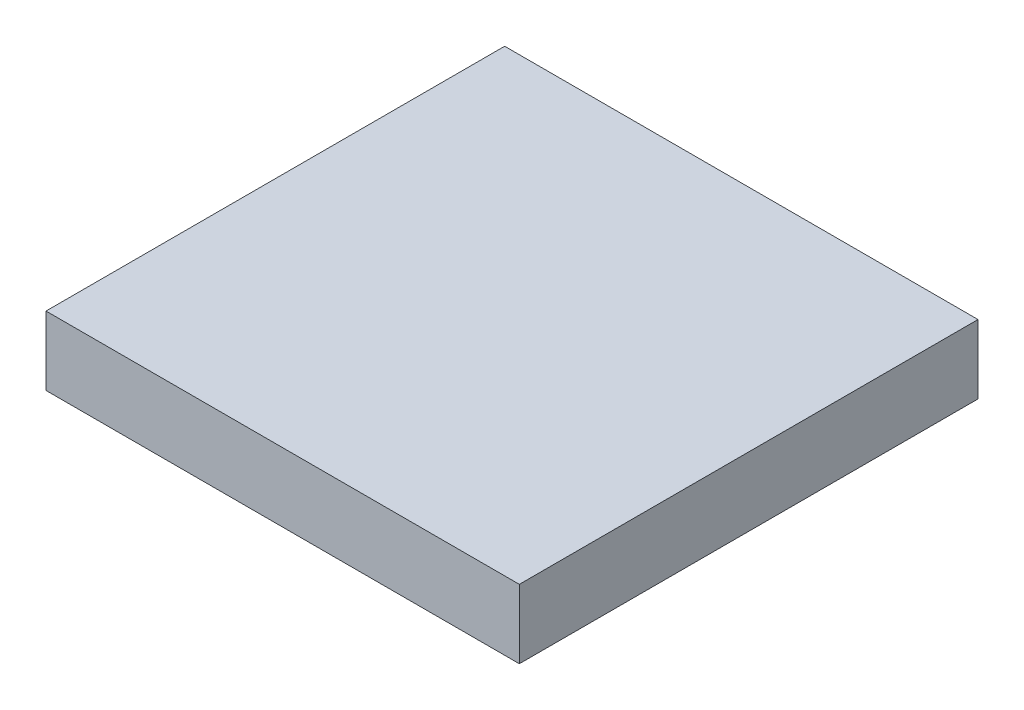
ISO-10303-21;
HEADER;
FILE_DESCRIPTION(('STEP AP214'),'2;1');
FILE_NAME('part.step','',(''),(''),'','','');
FILE_SCHEMA(('AUTOMOTIVE_DESIGN { 1 0 10303 214 1 1 1 1 }'));
ENDSEC;
DATA;
#1=APPLICATION_CONTEXT('core data for automotive mechanical design processes');
#2=APPLICATION_PROTOCOL_DEFINITION('international standard','automotive_design',2000,#1);
#3=PRODUCT_CONTEXT('',#1,'mechanical');
#4=PRODUCT('Part','Part','',(#3));
#5=PRODUCT_RELATED_PRODUCT_CATEGORY('part','',(#4));
#6=PRODUCT_DEFINITION_FORMATION('','',#4);
#7=PRODUCT_DEFINITION_CONTEXT('part definition',#1,'design');
#8=PRODUCT_DEFINITION('design','',#6,#7);
#9=PRODUCT_DEFINITION_SHAPE('','',#8);
#10=(LENGTH_UNIT() NAMED_UNIT(*) SI_UNIT(.MILLI.,.METRE.));
#11=(NAMED_UNIT(*) PLANE_ANGLE_UNIT() SI_UNIT($,.RADIAN.));
#12=(NAMED_UNIT(*) SI_UNIT($,.STERADIAN.) SOLID_ANGLE_UNIT());
#13=UNCERTAINTY_MEASURE_WITH_UNIT(LENGTH_MEASURE(1.E-05),#10,'distance_accuracy_value','');
#14=(GEOMETRIC_REPRESENTATION_CONTEXT(3) GLOBAL_UNCERTAINTY_ASSIGNED_CONTEXT((#13)) GLOBAL_UNIT_ASSIGNED_CONTEXT((#10,
#11,#12)) REPRESENTATION_CONTEXT('',''));
#15=CARTESIAN_POINT('',(0.,0.,0.));
#16=DIRECTION('',(0.,0.,1.));
#17=DIRECTION('',(1.,0.,0.));
#18=AXIS2_PLACEMENT_3D('',#15,#16,#17);
#19=CARTESIAN_POINT('',(-103.,30.,100.));
#20=DIRECTION('',(0.,0.,-1.));
#21=DIRECTION('',(-1.,0.,0.));
#22=AXIS2_PLACEMENT_3D('',#19,#20,#21);
#23=PLANE('',#22);
#24=DIRECTION('',(1.,0.,0.));
#25=VECTOR('',#24,1.);
#26=CARTESIAN_POINT('',(-103.,0.,100.));
#27=LINE('',#26,#25);
#28=CARTESIAN_POINT('',(-103.,0.,100.));
#29=VERTEX_POINT('',#28);
#30=CARTESIAN_POINT('',(103.4,0.,100.));
#31=VERTEX_POINT('',#30);
#32=EDGE_CURVE('E96',#29,#31,#27,.T.);
#33=ORIENTED_EDGE('',*,*,#32,.T.);
#34=DIRECTION('',(0.,-1.,0.));
#35=VECTOR('',#34,1.);
#36=CARTESIAN_POINT('',(103.4,30.,100.));
#37=LINE('',#36,#35);
#38=CARTESIAN_POINT('',(103.4,30.,100.));
#39=VERTEX_POINT('',#38);
#40=EDGE_CURVE('E11',#39,#31,#37,.T.);
#41=ORIENTED_EDGE('',*,*,#40,.F.);
#42=DIRECTION('',(1.,0.,0.));
#43=VECTOR('',#42,1.);
#44=CARTESIAN_POINT('',(-103.,30.,100.));
#45=LINE('',#44,#43);
#46=CARTESIAN_POINT('',(-103.,30.,100.));
#47=VERTEX_POINT('',#46);
#48=EDGE_CURVE('E82',#47,#39,#45,.T.);
#49=ORIENTED_EDGE('',*,*,#48,.F.);
#50=DIRECTION('',(0.,-1.,0.));
#51=VECTOR('',#50,1.);
#52=CARTESIAN_POINT('',(-103.,30.,100.));
#53=LINE('',#52,#51);
#54=EDGE_CURVE('E49',#47,#29,#53,.T.);
#55=ORIENTED_EDGE('',*,*,#54,.T.);
#56=EDGE_LOOP('',(#33,#41,#49,#55));
#57=FACE_BOUND('',#56,.T.);
#58=ADVANCED_FACE('F33',(#57),#23,.F.);
#59=CARTESIAN_POINT('',(103.4,30.,100.));
#60=DIRECTION('',(-1.,0.,0.));
#61=DIRECTION('',(0.,0.,1.));
#62=AXIS2_PLACEMENT_3D('',#59,#60,#61);
#63=PLANE('',#62);
#64=DIRECTION('',(0.,0.,-1.));
#65=VECTOR('',#64,1.);
#66=CARTESIAN_POINT('',(103.4,0.,100.));
#67=LINE('',#66,#65);
#68=CARTESIAN_POINT('',(103.4,0.,-100.));
#69=VERTEX_POINT('',#68);
#70=EDGE_CURVE('E87',#31,#69,#67,.T.);
#71=ORIENTED_EDGE('',*,*,#70,.T.);
#72=DIRECTION('',(0.,-1.,0.));
#73=VECTOR('',#72,1.);
#74=CARTESIAN_POINT('',(103.4,30.,-100.));
#75=LINE('',#74,#73);
#76=CARTESIAN_POINT('',(103.4,30.,-100.));
#77=VERTEX_POINT('',#76);
#78=EDGE_CURVE('E41',#77,#69,#75,.T.);
#79=ORIENTED_EDGE('',*,*,#78,.F.);
#80=DIRECTION('',(0.,0.,-1.));
#81=VECTOR('',#80,1.);
#82=CARTESIAN_POINT('',(103.4,30.,100.));
#83=LINE('',#82,#81);
#84=EDGE_CURVE('E74',#39,#77,#83,.T.);
#85=ORIENTED_EDGE('',*,*,#84,.F.);
#86=ORIENTED_EDGE('',*,*,#40,.T.);
#87=EDGE_LOOP('',(#71,#79,#85,#86));
#88=FACE_BOUND('',#87,.T.);
#89=ADVANCED_FACE('F86',(#88),#63,.F.);
#90=CARTESIAN_POINT('',(-103.,30.,-100.));
#91=DIRECTION('',(0.,0.,-1.));
#92=DIRECTION('',(-1.,0.,0.));
#93=AXIS2_PLACEMENT_3D('',#90,#91,#92);
#94=PLANE('',#93);
#95=DIRECTION('',(1.,0.,0.));
#96=VECTOR('',#95,1.);
#97=CARTESIAN_POINT('',(-103.,0.,-100.));
#98=LINE('',#97,#96);
#99=CARTESIAN_POINT('',(-103.,0.,-100.));
#100=VERTEX_POINT('',#99);
#101=EDGE_CURVE('E99',#100,#69,#98,.T.);
#102=ORIENTED_EDGE('',*,*,#101,.F.);
#103=DIRECTION('',(0.,-1.,0.));
#104=VECTOR('',#103,1.);
#105=CARTESIAN_POINT('',(-103.,30.,-100.));
#106=LINE('',#105,#104);
#107=CARTESIAN_POINT('',(-103.,30.,-100.));
#108=VERTEX_POINT('',#107);
#109=EDGE_CURVE('E63',#108,#100,#106,.T.);
#110=ORIENTED_EDGE('',*,*,#109,.F.);
#111=DIRECTION('',(1.,0.,0.));
#112=VECTOR('',#111,1.);
#113=CARTESIAN_POINT('',(-103.,30.,-100.));
#114=LINE('',#113,#112);
#115=EDGE_CURVE('E81',#108,#77,#114,.T.);
#116=ORIENTED_EDGE('',*,*,#115,.T.);
#117=ORIENTED_EDGE('',*,*,#78,.T.);
#118=EDGE_LOOP('',(#102,#110,#116,#117));
#119=FACE_BOUND('',#118,.T.);
#120=ADVANCED_FACE('F90',(#119),#94,.T.);
#121=CARTESIAN_POINT('',(-103.,30.,100.));
#122=DIRECTION('',(-1.,0.,0.));
#123=DIRECTION('',(0.,0.,1.));
#124=AXIS2_PLACEMENT_3D('',#121,#122,#123);
#125=PLANE('',#124);
#126=DIRECTION('',(0.,0.,-1.));
#127=VECTOR('',#126,1.);
#128=CARTESIAN_POINT('',(-103.,0.,100.));
#129=LINE('',#128,#127);
#130=EDGE_CURVE('E101',#29,#100,#129,.T.);
#131=ORIENTED_EDGE('',*,*,#130,.F.);
#132=ORIENTED_EDGE('',*,*,#54,.F.);
#133=DIRECTION('',(0.,0.,-1.));
#134=VECTOR('',#133,1.);
#135=CARTESIAN_POINT('',(-103.,30.,100.));
#136=LINE('',#135,#134);
#137=EDGE_CURVE('E91',#47,#108,#136,.T.);
#138=ORIENTED_EDGE('',*,*,#137,.T.);
#139=ORIENTED_EDGE('',*,*,#109,.T.);
#140=EDGE_LOOP('',(#131,#132,#138,#139));
#141=FACE_BOUND('',#140,.T.);
#142=ADVANCED_FACE('F107',(#141),#125,.T.);
#143=CARTESIAN_POINT('',(0.,30.,0.));
#144=DIRECTION('',(0.,1.,0.));
#145=DIRECTION('',(0.,0.,1.));
#146=AXIS2_PLACEMENT_3D('',#143,#144,#145);
#147=PLANE('',#146);
#148=ORIENTED_EDGE('',*,*,#48,.T.);
#149=ORIENTED_EDGE('',*,*,#84,.T.);
#150=ORIENTED_EDGE('',*,*,#115,.F.);
#151=ORIENTED_EDGE('',*,*,#137,.F.);
#152=EDGE_LOOP('',(#148,#149,#150,#151));
#153=FACE_BOUND('',#152,.T.);
#154=ADVANCED_FACE('F78',(#153),#147,.T.);
#155=CARTESIAN_POINT('',(0.,0.,0.));
#156=DIRECTION('',(0.,1.,0.));
#157=DIRECTION('',(0.,0.,1.));
#158=AXIS2_PLACEMENT_3D('',#155,#156,#157);
#159=PLANE('',#158);
#160=ORIENTED_EDGE('',*,*,#32,.F.);
#161=ORIENTED_EDGE('',*,*,#130,.T.);
#162=ORIENTED_EDGE('',*,*,#101,.T.);
#163=ORIENTED_EDGE('',*,*,#70,.F.);
#164=EDGE_LOOP('',(#160,#161,#162,#163));
#165=FACE_BOUND('',#164,.T.);
#166=ADVANCED_FACE('F106',(#165),#159,.F.);
#167=CLOSED_SHELL('',(#58,#89,#120,#142,#154,#166));
#168=MANIFOLD_SOLID_BREP('B2',#167);
#169=ADVANCED_BREP_SHAPE_REPRESENTATION('',(#18,#168),#14);
#170=SHAPE_DEFINITION_REPRESENTATION(#9,#169);
ENDSEC;
END-ISO-10303-21;
